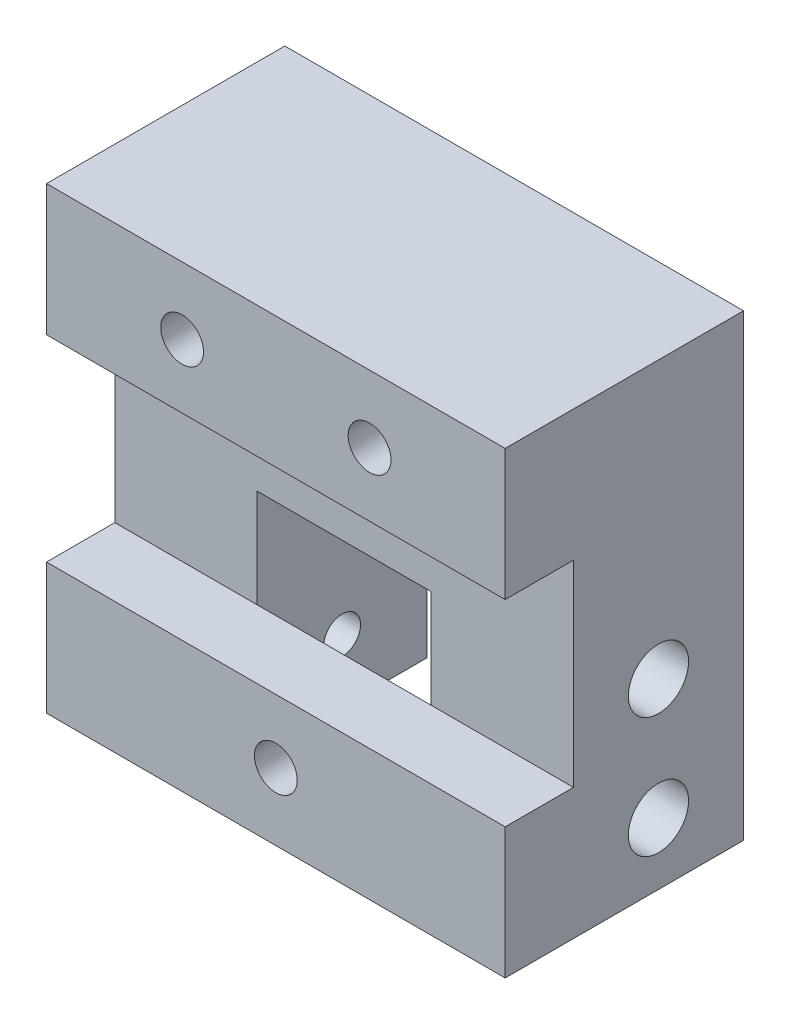
ISO-10303-21;
HEADER;
FILE_DESCRIPTION(('STEP AP214'),'2;1');
FILE_NAME('part.step','',(''),(''),'','','');
FILE_SCHEMA(('AUTOMOTIVE_DESIGN { 1 0 10303 214 1 1 1 1 }'));
ENDSEC;
DATA;
#1=APPLICATION_CONTEXT('core data for automotive mechanical design processes');
#2=APPLICATION_PROTOCOL_DEFINITION('international standard','automotive_design',2000,#1);
#3=PRODUCT_CONTEXT('',#1,'mechanical');
#4=PRODUCT('Part','Part','',(#3));
#5=PRODUCT_RELATED_PRODUCT_CATEGORY('part','',(#4));
#6=PRODUCT_DEFINITION_FORMATION('','',#4);
#7=PRODUCT_DEFINITION_CONTEXT('part definition',#1,'design');
#8=PRODUCT_DEFINITION('design','',#6,#7);
#9=PRODUCT_DEFINITION_SHAPE('','',#8);
#10=(LENGTH_UNIT() NAMED_UNIT(*) SI_UNIT(.MILLI.,.METRE.));
#11=(NAMED_UNIT(*) PLANE_ANGLE_UNIT() SI_UNIT($,.RADIAN.));
#12=(NAMED_UNIT(*) SI_UNIT($,.STERADIAN.) SOLID_ANGLE_UNIT());
#13=UNCERTAINTY_MEASURE_WITH_UNIT(LENGTH_MEASURE(1.E-05),#10,'distance_accuracy_value','');
#14=(GEOMETRIC_REPRESENTATION_CONTEXT(3) GLOBAL_UNCERTAINTY_ASSIGNED_CONTEXT((#13)) GLOBAL_UNIT_ASSIGNED_CONTEXT((#10,
#11,#12)) REPRESENTATION_CONTEXT('',''));
#15=CARTESIAN_POINT('',(0.,0.,0.));
#16=DIRECTION('',(0.,0.,1.));
#17=DIRECTION('',(1.,0.,0.));
#18=AXIS2_PLACEMENT_3D('',#15,#16,#17);
#19=CARTESIAN_POINT('',(-34.26,-25.,12.7));
#20=DIRECTION('',(1.,0.,0.));
#21=DIRECTION('',(0.,0.,-1.));
#22=AXIS2_PLACEMENT_3D('',#19,#20,#21);
#23=CYLINDRICAL_SURFACE('',#22,2.75);
#24=CARTESIAN_POINT('',(-13.,-25.,12.7));
#25=DIRECTION('',(-1.,0.,0.));
#26=DIRECTION('',(0.,-1.,0.));
#27=AXIS2_PLACEMENT_3D('',#24,#25,#26);
#28=CIRCLE('',#27,2.75);
#29=CARTESIAN_POINT('',(-13.,-27.75,12.7));
#30=VERTEX_POINT('',#29);
#31=EDGE_CURVE('E255',#30,#30,#28,.T.);
#32=ORIENTED_EDGE('',*,*,#31,.F.);
#33=EDGE_LOOP('',(#32));
#34=FACE_BOUND('',#33,.T.);
#35=CARTESIAN_POINT('',(-21.,-25.,12.7));
#36=DIRECTION('',(-1.,0.,0.));
#37=DIRECTION('',(0.,-1.,0.));
#38=AXIS2_PLACEMENT_3D('',#35,#36,#37);
#39=CIRCLE('',#38,2.75);
#40=CARTESIAN_POINT('',(-21.,-27.75,12.7));
#41=VERTEX_POINT('',#40);
#42=EDGE_CURVE('E43',#41,#41,#39,.F.);
#43=ORIENTED_EDGE('',*,*,#42,.F.);
#44=EDGE_LOOP('',(#43));
#45=FACE_BOUND('',#44,.T.);
#46=ADVANCED_FACE('F39',(#34,#45),#23,.F.);
#47=CARTESIAN_POINT('',(-34.26,-7.,12.7));
#48=DIRECTION('',(1.,0.,0.));
#49=DIRECTION('',(0.,0.,-1.));
#50=AXIS2_PLACEMENT_3D('',#47,#48,#49);
#51=CYLINDRICAL_SURFACE('',#50,2.75);
#52=CARTESIAN_POINT('',(-13.,-7.,12.7));
#53=DIRECTION('',(-1.,0.,0.));
#54=DIRECTION('',(0.,-1.,0.));
#55=AXIS2_PLACEMENT_3D('',#52,#53,#54);
#56=CIRCLE('',#55,2.75);
#57=CARTESIAN_POINT('',(-13.,-9.75,12.7));
#58=VERTEX_POINT('',#57);
#59=EDGE_CURVE('E260',#58,#58,#56,.T.);
#60=ORIENTED_EDGE('',*,*,#59,.F.);
#61=EDGE_LOOP('',(#60));
#62=FACE_BOUND('',#61,.T.);
#63=CARTESIAN_POINT('',(-21.,-7.,12.7));
#64=DIRECTION('',(-1.,0.,0.));
#65=DIRECTION('',(0.,-1.,0.));
#66=AXIS2_PLACEMENT_3D('',#63,#64,#65);
#67=CIRCLE('',#66,2.75);
#68=CARTESIAN_POINT('',(-21.,-9.75,12.7));
#69=VERTEX_POINT('',#68);
#70=EDGE_CURVE('E268',#69,#69,#67,.F.);
#71=ORIENTED_EDGE('',*,*,#70,.F.);
#72=EDGE_LOOP('',(#71));
#73=FACE_BOUND('',#72,.T.);
#74=ADVANCED_FACE('F311',(#62,#73),#51,.F.);
#75=CARTESIAN_POINT('',(13.,-25.,12.7));
#76=DIRECTION('',(1.,0.,0.));
#77=DIRECTION('',(0.,1.,0.));
#78=AXIS2_PLACEMENT_3D('',#75,#76,#77);
#79=CIRCLE('',#78,2.75);
#80=CARTESIAN_POINT('',(13.,-22.25,12.7));
#81=VERTEX_POINT('',#80);
#82=EDGE_CURVE('E258',#81,#81,#79,.T.);
#83=ORIENTED_EDGE('',*,*,#82,.F.);
#84=EDGE_LOOP('',(#83));
#85=FACE_BOUND('',#84,.T.);
#86=CARTESIAN_POINT('',(21.,-25.,12.7));
#87=DIRECTION('',(1.,0.,0.));
#88=DIRECTION('',(0.,1.,0.));
#89=AXIS2_PLACEMENT_3D('',#86,#87,#88);
#90=CIRCLE('',#89,2.75);
#91=CARTESIAN_POINT('',(21.,-22.25,12.7));
#92=VERTEX_POINT('',#91);
#93=EDGE_CURVE('E259',#92,#92,#90,.F.);
#94=ORIENTED_EDGE('',*,*,#93,.F.);
#95=EDGE_LOOP('',(#94));
#96=FACE_BOUND('',#95,.T.);
#97=ADVANCED_FACE('F309',(#85,#96),#23,.F.);
#98=CARTESIAN_POINT('',(13.,-7.,12.7));
#99=DIRECTION('',(1.,0.,0.));
#100=DIRECTION('',(0.,1.,0.));
#101=AXIS2_PLACEMENT_3D('',#98,#99,#100);
#102=CIRCLE('',#101,2.75);
#103=CARTESIAN_POINT('',(13.,-4.25,12.7));
#104=VERTEX_POINT('',#103);
#105=EDGE_CURVE('E169',#104,#104,#102,.T.);
#106=ORIENTED_EDGE('',*,*,#105,.F.);
#107=EDGE_LOOP('',(#106));
#108=FACE_BOUND('',#107,.T.);
#109=CARTESIAN_POINT('',(21.,-7.,12.7));
#110=DIRECTION('',(1.,0.,0.));
#111=DIRECTION('',(0.,1.,0.));
#112=AXIS2_PLACEMENT_3D('',#109,#110,#111);
#113=CIRCLE('',#112,2.75);
#114=CARTESIAN_POINT('',(21.,-4.25,12.7));
#115=VERTEX_POINT('',#114);
#116=EDGE_CURVE('E263',#115,#115,#113,.F.);
#117=ORIENTED_EDGE('',*,*,#116,.F.);
#118=EDGE_LOOP('',(#117));
#119=FACE_BOUND('',#118,.T.);
#120=ADVANCED_FACE('F305',(#108,#119),#51,.F.);
#121=CARTESIAN_POINT('',(0.,0.,35.6));
#122=DIRECTION('',(0.,0.,1.));
#123=DIRECTION('',(1.,0.,0.));
#124=AXIS2_PLACEMENT_3D('',#121,#122,#123);
#125=PLANE('',#124);
#126=CARTESIAN_POINT('',(-14.,24.2141445,35.6));
#127=DIRECTION('',(0.,0.,1.));
#128=DIRECTION('',(1.,0.,0.));
#129=AXIS2_PLACEMENT_3D('',#126,#127,#128);
#130=CIRCLE('',#129,3.2);
#131=CARTESIAN_POINT('',(-10.8,24.2141445,35.6));
#132=VERTEX_POINT('',#131);
#133=EDGE_CURVE('E183',#132,#132,#130,.T.);
#134=ORIENTED_EDGE('',*,*,#133,.F.);
#135=EDGE_LOOP('',(#134));
#136=FACE_BOUND('',#135,.T.);
#137=CARTESIAN_POINT('',(14.,24.2141445,35.6));
#138=DIRECTION('',(0.,0.,1.));
#139=DIRECTION('',(1.,0.,0.));
#140=AXIS2_PLACEMENT_3D('',#137,#138,#139);
#141=CIRCLE('',#140,3.2);
#142=CARTESIAN_POINT('',(17.2,24.2141445,35.6));
#143=VERTEX_POINT('',#142);
#144=EDGE_CURVE('E186',#143,#143,#141,.T.);
#145=ORIENTED_EDGE('',*,*,#144,.F.);
#146=EDGE_LOOP('',(#145));
#147=FACE_BOUND('',#146,.T.);
#148=DIRECTION('',(-1.,0.,0.));
#149=VECTOR('',#148,1.);
#150=CARTESIAN_POINT('',(-34.26,14.7,35.6));
#151=LINE('',#150,#149);
#152=CARTESIAN_POINT('',(34.26,14.7,35.6));
#153=VERTEX_POINT('',#152);
#154=CARTESIAN_POINT('',(-34.26,14.7,35.6));
#155=VERTEX_POINT('',#154);
#156=EDGE_CURVE('E201',#153,#155,#151,.T.);
#157=ORIENTED_EDGE('',*,*,#156,.F.);
#158=DIRECTION('',(0.,1.,0.));
#159=VECTOR('',#158,1.);
#160=CARTESIAN_POINT('',(34.26,34.26,35.6));
#161=LINE('',#160,#159);
#162=CARTESIAN_POINT('',(34.26,34.26,35.6));
#163=VERTEX_POINT('',#162);
#164=EDGE_CURVE('E229',#153,#163,#161,.T.);
#165=ORIENTED_EDGE('',*,*,#164,.T.);
#166=DIRECTION('',(-1.,0.,0.));
#167=VECTOR('',#166,1.);
#168=CARTESIAN_POINT('',(-34.26,34.26,35.6));
#169=LINE('',#168,#167);
#170=CARTESIAN_POINT('',(-34.26,34.26,35.6));
#171=VERTEX_POINT('',#170);
#172=EDGE_CURVE('E233',#163,#171,#169,.T.);
#173=ORIENTED_EDGE('',*,*,#172,.T.);
#174=DIRECTION('',(0.,-1.,0.));
#175=VECTOR('',#174,1.);
#176=CARTESIAN_POINT('',(-34.26,34.26,35.6));
#177=LINE('',#176,#175);
#178=EDGE_CURVE('E223',#171,#155,#177,.T.);
#179=ORIENTED_EDGE('',*,*,#178,.T.);
#180=EDGE_LOOP('',(#157,#165,#173,#179));
#181=FACE_BOUND('',#180,.T.);
#182=ADVANCED_FACE('F308',(#136,#147,#181),#125,.T.);
#183=CARTESIAN_POINT('',(-34.26,34.26,35.6));
#184=DIRECTION('',(1.,0.,0.));
#185=DIRECTION('',(0.,0.,-1.));
#186=AXIS2_PLACEMENT_3D('',#183,#184,#185);
#187=PLANE('',#186);
#188=CARTESIAN_POINT('',(-34.26,-7.,12.7));
#189=DIRECTION('',(-1.,0.,0.));
#190=DIRECTION('',(0.,-1.,0.));
#191=AXIS2_PLACEMENT_3D('',#188,#189,#190);
#192=CIRCLE('',#191,4.5);
#193=CARTESIAN_POINT('',(-34.26,-11.5,12.7));
#194=VERTEX_POINT('',#193);
#195=EDGE_CURVE('E276',#194,#194,#192,.T.);
#196=ORIENTED_EDGE('',*,*,#195,.F.);
#197=EDGE_LOOP('',(#196));
#198=FACE_BOUND('',#197,.T.);
#199=CARTESIAN_POINT('',(-34.26,-25.,12.7));
#200=DIRECTION('',(-1.,0.,0.));
#201=DIRECTION('',(0.,-1.,0.));
#202=AXIS2_PLACEMENT_3D('',#199,#200,#201);
#203=CIRCLE('',#202,4.5);
#204=CARTESIAN_POINT('',(-34.26,-29.5,12.7));
#205=VERTEX_POINT('',#204);
#206=EDGE_CURVE('E281',#205,#205,#203,.T.);
#207=ORIENTED_EDGE('',*,*,#206,.F.);
#208=EDGE_LOOP('',(#207));
#209=FACE_BOUND('',#208,.T.);
#210=DIRECTION('',(0.,-1.,0.));
#211=VECTOR('',#210,1.);
#212=CARTESIAN_POINT('',(-34.26,-14.7,25.4));
#213=LINE('',#212,#211);
#214=CARTESIAN_POINT('',(-34.26,14.7,25.4));
#215=VERTEX_POINT('',#214);
#216=CARTESIAN_POINT('',(-34.26,-14.7,25.4));
#217=VERTEX_POINT('',#216);
#218=EDGE_CURVE('E197',#215,#217,#213,.T.);
#219=ORIENTED_EDGE('',*,*,#218,.F.);
#220=DIRECTION('',(0.,0.,1.));
#221=VECTOR('',#220,1.);
#222=CARTESIAN_POINT('',(-34.26,14.7,25.4));
#223=LINE('',#222,#221);
#224=EDGE_CURVE('E213',#215,#155,#223,.T.);
#225=ORIENTED_EDGE('',*,*,#224,.T.);
#226=ORIENTED_EDGE('',*,*,#178,.F.);
#227=DIRECTION('',(0.,0.,-1.));
#228=VECTOR('',#227,1.);
#229=CARTESIAN_POINT('',(-34.26,34.26,35.6));
#230=LINE('',#229,#228);
#231=CARTESIAN_POINT('',(-34.26,34.26,0.));
#232=VERTEX_POINT('',#231);
#233=EDGE_CURVE('E235',#171,#232,#230,.T.);
#234=ORIENTED_EDGE('',*,*,#233,.T.);
#235=DIRECTION('',(0.,-1.,0.));
#236=VECTOR('',#235,1.);
#237=CARTESIAN_POINT('',(-34.26,34.26,0.));
#238=LINE('',#237,#236);
#239=CARTESIAN_POINT('',(-34.26,-34.26,0.));
#240=VERTEX_POINT('',#239);
#241=EDGE_CURVE('E216',#232,#240,#238,.T.);
#242=ORIENTED_EDGE('',*,*,#241,.T.);
#243=DIRECTION('',(0.,0.,-1.));
#244=VECTOR('',#243,1.);
#245=CARTESIAN_POINT('',(-34.26,-34.26,35.6));
#246=LINE('',#245,#244);
#247=CARTESIAN_POINT('',(-34.26,-34.26,35.6));
#248=VERTEX_POINT('',#247);
#249=EDGE_CURVE('E48',#248,#240,#246,.T.);
#250=ORIENTED_EDGE('',*,*,#249,.F.);
#251=CARTESIAN_POINT('',(-34.26,-14.7,35.6));
#252=VERTEX_POINT('',#251);
#253=EDGE_CURVE('E227',#252,#248,#177,.T.);
#254=ORIENTED_EDGE('',*,*,#253,.F.);
#255=DIRECTION('',(0.,0.,1.));
#256=VECTOR('',#255,1.);
#257=CARTESIAN_POINT('',(-34.26,-14.7,25.4));
#258=LINE('',#257,#256);
#259=EDGE_CURVE('E210',#217,#252,#258,.T.);
#260=ORIENTED_EDGE('',*,*,#259,.F.);
#261=EDGE_LOOP('',(#219,#225,#226,#234,#242,#250,#254,#260));
#262=FACE_BOUND('',#261,.T.);
#263=ADVANCED_FACE('F41',(#198,#209,#262),#187,.F.);
#264=CARTESIAN_POINT('',(-34.26,-34.26,35.6));
#265=DIRECTION('',(0.,1.,0.));
#266=DIRECTION('',(-1.,0.,0.));
#267=AXIS2_PLACEMENT_3D('',#264,#265,#266);
#268=PLANE('',#267);
#269=DIRECTION('',(-1.,0.,0.));
#270=VECTOR('',#269,1.);
#271=CARTESIAN_POINT('',(13.,-34.26,25.4));
#272=LINE('',#271,#270);
#273=CARTESIAN_POINT('',(13.,-34.26,25.4));
#274=VERTEX_POINT('',#273);
#275=CARTESIAN_POINT('',(-13.,-34.26,25.4));
#276=VERTEX_POINT('',#275);
#277=EDGE_CURVE('E142',#274,#276,#272,.T.);
#278=ORIENTED_EDGE('',*,*,#277,.F.);
#279=DIRECTION('',(0.,0.,-1.));
#280=VECTOR('',#279,1.);
#281=CARTESIAN_POINT('',(13.,-34.26,25.4));
#282=LINE('',#281,#280);
#283=CARTESIAN_POINT('',(13.,-34.26,0.));
#284=VERTEX_POINT('',#283);
#285=EDGE_CURVE('E152',#274,#284,#282,.T.);
#286=ORIENTED_EDGE('',*,*,#285,.T.);
#287=DIRECTION('',(1.,0.,0.));
#288=VECTOR('',#287,1.);
#289=CARTESIAN_POINT('',(-34.26,-34.26,0.));
#290=LINE('',#289,#288);
#291=CARTESIAN_POINT('',(34.26,-34.26,0.));
#292=VERTEX_POINT('',#291);
#293=EDGE_CURVE('E238',#284,#292,#290,.T.);
#294=ORIENTED_EDGE('',*,*,#293,.T.);
#295=DIRECTION('',(0.,0.,-1.));
#296=VECTOR('',#295,1.);
#297=CARTESIAN_POINT('',(34.26,-34.26,35.6));
#298=LINE('',#297,#296);
#299=CARTESIAN_POINT('',(34.26,-34.26,35.6));
#300=VERTEX_POINT('',#299);
#301=EDGE_CURVE('E250',#300,#292,#298,.T.);
#302=ORIENTED_EDGE('',*,*,#301,.F.);
#303=DIRECTION('',(1.,0.,0.));
#304=VECTOR('',#303,1.);
#305=CARTESIAN_POINT('',(-34.26,-34.26,35.6));
#306=LINE('',#305,#304);
#307=EDGE_CURVE('E226',#248,#300,#306,.T.);
#308=ORIENTED_EDGE('',*,*,#307,.F.);
#309=ORIENTED_EDGE('',*,*,#249,.T.);
#310=CARTESIAN_POINT('',(-13.,-34.26,0.));
#311=VERTEX_POINT('',#310);
#312=EDGE_CURVE('E239',#240,#311,#290,.T.);
#313=ORIENTED_EDGE('',*,*,#312,.T.);
#314=DIRECTION('',(0.,0.,-1.));
#315=VECTOR('',#314,1.);
#316=CARTESIAN_POINT('',(-13.,-34.26,25.4));
#317=LINE('',#316,#315);
#318=EDGE_CURVE('E56',#276,#311,#317,.T.);
#319=ORIENTED_EDGE('',*,*,#318,.F.);
#320=EDGE_LOOP('',(#278,#286,#294,#302,#308,#309,#313,#319));
#321=FACE_BOUND('',#320,.T.);
#322=ADVANCED_FACE('F159',(#321),#268,.F.);
#323=CARTESIAN_POINT('',(34.26,34.26,35.6));
#324=DIRECTION('',(-1.,0.,0.));
#325=DIRECTION('',(0.,0.,1.));
#326=AXIS2_PLACEMENT_3D('',#323,#324,#325);
#327=PLANE('',#326);
#328=CARTESIAN_POINT('',(34.26,-7.,12.7));
#329=DIRECTION('',(1.,0.,0.));
#330=DIRECTION('',(0.,0.,-1.));
#331=AXIS2_PLACEMENT_3D('',#328,#329,#330);
#332=CIRCLE('',#331,4.5);
#333=CARTESIAN_POINT('',(34.26,-7.,8.2));
#334=VERTEX_POINT('',#333);
#335=EDGE_CURVE('E289',#334,#334,#332,.T.);
#336=ORIENTED_EDGE('',*,*,#335,.F.);
#337=EDGE_LOOP('',(#336));
#338=FACE_BOUND('',#337,.T.);
#339=CARTESIAN_POINT('',(34.26,-25.,12.7));
#340=DIRECTION('',(1.,0.,0.));
#341=DIRECTION('',(0.,0.,-1.));
#342=AXIS2_PLACEMENT_3D('',#339,#340,#341);
#343=CIRCLE('',#342,4.5);
#344=CARTESIAN_POINT('',(34.26,-25.,8.2));
#345=VERTEX_POINT('',#344);
#346=EDGE_CURVE('E292',#345,#345,#343,.T.);
#347=ORIENTED_EDGE('',*,*,#346,.F.);
#348=EDGE_LOOP('',(#347));
#349=FACE_BOUND('',#348,.T.);
#350=ORIENTED_EDGE('',*,*,#164,.F.);
#351=DIRECTION('',(0.,0.,1.));
#352=VECTOR('',#351,1.);
#353=CARTESIAN_POINT('',(34.26,14.7,25.4));
#354=LINE('',#353,#352);
#355=CARTESIAN_POINT('',(34.26,14.7,25.4));
#356=VERTEX_POINT('',#355);
#357=EDGE_CURVE('E217',#356,#153,#354,.T.);
#358=ORIENTED_EDGE('',*,*,#357,.F.);
#359=DIRECTION('',(0.,1.,0.));
#360=VECTOR('',#359,1.);
#361=CARTESIAN_POINT('',(34.26,-14.7,25.4));
#362=LINE('',#361,#360);
#363=CARTESIAN_POINT('',(34.26,-14.7,25.4));
#364=VERTEX_POINT('',#363);
#365=EDGE_CURVE('E205',#364,#356,#362,.T.);
#366=ORIENTED_EDGE('',*,*,#365,.F.);
#367=DIRECTION('',(0.,0.,1.));
#368=VECTOR('',#367,1.);
#369=CARTESIAN_POINT('',(34.26,-14.7,25.4));
#370=LINE('',#369,#368);
#371=CARTESIAN_POINT('',(34.26,-14.7,35.6));
#372=VERTEX_POINT('',#371);
#373=EDGE_CURVE('E219',#364,#372,#370,.T.);
#374=ORIENTED_EDGE('',*,*,#373,.T.);
#375=EDGE_CURVE('E230',#300,#372,#161,.T.);
#376=ORIENTED_EDGE('',*,*,#375,.F.);
#377=ORIENTED_EDGE('',*,*,#301,.T.);
#378=DIRECTION('',(0.,1.,0.));
#379=VECTOR('',#378,1.);
#380=CARTESIAN_POINT('',(34.26,34.26,0.));
#381=LINE('',#380,#379);
#382=CARTESIAN_POINT('',(34.26,34.26,0.));
#383=VERTEX_POINT('',#382);
#384=EDGE_CURVE('E241',#292,#383,#381,.T.);
#385=ORIENTED_EDGE('',*,*,#384,.T.);
#386=DIRECTION('',(0.,0.,-1.));
#387=VECTOR('',#386,1.);
#388=CARTESIAN_POINT('',(34.26,34.26,35.6));
#389=LINE('',#388,#387);
#390=EDGE_CURVE('E247',#163,#383,#389,.T.);
#391=ORIENTED_EDGE('',*,*,#390,.F.);
#392=EDGE_LOOP('',(#350,#358,#366,#374,#376,#377,#385,#391));
#393=FACE_BOUND('',#392,.T.);
#394=ADVANCED_FACE('F364',(#338,#349,#393),#327,.F.);
#395=CARTESIAN_POINT('',(-34.26,34.26,35.6));
#396=DIRECTION('',(0.,-1.,0.));
#397=DIRECTION('',(1.,0.,0.));
#398=AXIS2_PLACEMENT_3D('',#395,#396,#397);
#399=PLANE('',#398);
#400=DIRECTION('',(-1.,0.,0.));
#401=VECTOR('',#400,1.);
#402=CARTESIAN_POINT('',(-34.26,34.26,0.));
#403=LINE('',#402,#401);
#404=EDGE_CURVE('E243',#383,#232,#403,.T.);
#405=ORIENTED_EDGE('',*,*,#404,.T.);
#406=ORIENTED_EDGE('',*,*,#233,.F.);
#407=ORIENTED_EDGE('',*,*,#172,.F.);
#408=ORIENTED_EDGE('',*,*,#390,.T.);
#409=EDGE_LOOP('',(#405,#406,#407,#408));
#410=FACE_BOUND('',#409,.T.);
#411=ADVANCED_FACE('F367',(#410),#399,.F.);
#412=CARTESIAN_POINT('',(0.,-24.2141445,35.6));
#413=DIRECTION('',(0.,0.,1.));
#414=DIRECTION('',(1.,0.,0.));
#415=AXIS2_PLACEMENT_3D('',#412,#413,#414);
#416=CIRCLE('',#415,3.2);
#417=CARTESIAN_POINT('',(3.2,-24.2141445,35.6));
#418=VERTEX_POINT('',#417);
#419=EDGE_CURVE('E192',#418,#418,#416,.T.);
#420=ORIENTED_EDGE('',*,*,#419,.F.);
#421=EDGE_LOOP('',(#420));
#422=FACE_BOUND('',#421,.T.);
#423=DIRECTION('',(1.,0.,0.));
#424=VECTOR('',#423,1.);
#425=CARTESIAN_POINT('',(-34.26,-14.7,35.6));
#426=LINE('',#425,#424);
#427=EDGE_CURVE('E182',#252,#372,#426,.T.);
#428=ORIENTED_EDGE('',*,*,#427,.F.);
#429=ORIENTED_EDGE('',*,*,#253,.T.);
#430=ORIENTED_EDGE('',*,*,#307,.T.);
#431=ORIENTED_EDGE('',*,*,#375,.T.);
#432=EDGE_LOOP('',(#428,#429,#430,#431));
#433=FACE_BOUND('',#432,.T.);
#434=ADVANCED_FACE('F394',(#422,#433),#125,.T.);
#435=CARTESIAN_POINT('',(0.,0.,0.));
#436=DIRECTION('',(0.,0.,1.));
#437=DIRECTION('',(1.,0.,0.));
#438=AXIS2_PLACEMENT_3D('',#435,#436,#437);
#439=PLANE('',#438);
#440=ORIENTED_EDGE('',*,*,#293,.F.);
#441=DIRECTION('',(0.,-1.,0.));
#442=VECTOR('',#441,1.);
#443=CARTESIAN_POINT('',(13.,-34.26,0.));
#444=LINE('',#443,#442);
#445=CARTESIAN_POINT('',(13.,0.,0.));
#446=VERTEX_POINT('',#445);
#447=EDGE_CURVE('E155',#446,#284,#444,.T.);
#448=ORIENTED_EDGE('',*,*,#447,.F.);
#449=DIRECTION('',(1.,0.,0.));
#450=VECTOR('',#449,1.);
#451=CARTESIAN_POINT('',(13.,0.,0.));
#452=LINE('',#451,#450);
#453=CARTESIAN_POINT('',(-13.,0.,0.));
#454=VERTEX_POINT('',#453);
#455=EDGE_CURVE('E149',#454,#446,#452,.T.);
#456=ORIENTED_EDGE('',*,*,#455,.F.);
#457=DIRECTION('',(0.,1.,0.));
#458=VECTOR('',#457,1.);
#459=CARTESIAN_POINT('',(-13.,-34.26,0.));
#460=LINE('',#459,#458);
#461=EDGE_CURVE('E168',#311,#454,#460,.T.);
#462=ORIENTED_EDGE('',*,*,#461,.F.);
#463=ORIENTED_EDGE('',*,*,#312,.F.);
#464=ORIENTED_EDGE('',*,*,#241,.F.);
#465=ORIENTED_EDGE('',*,*,#404,.F.);
#466=ORIENTED_EDGE('',*,*,#384,.F.);
#467=EDGE_LOOP('',(#440,#448,#456,#462,#463,#464,#465,#466));
#468=FACE_BOUND('',#467,.T.);
#469=ADVANCED_FACE('F401',(#468),#439,.F.);
#470=CARTESIAN_POINT('',(-34.26,14.7,25.4));
#471=DIRECTION('',(0.,1.,0.));
#472=DIRECTION('',(-1.,0.,0.));
#473=AXIS2_PLACEMENT_3D('',#470,#471,#472);
#474=PLANE('',#473);
#475=ORIENTED_EDGE('',*,*,#156,.T.);
#476=ORIENTED_EDGE('',*,*,#224,.F.);
#477=DIRECTION('',(-1.,0.,0.));
#478=VECTOR('',#477,1.);
#479=CARTESIAN_POINT('',(-34.26,14.7,25.4));
#480=LINE('',#479,#478);
#481=EDGE_CURVE('E207',#356,#215,#480,.T.);
#482=ORIENTED_EDGE('',*,*,#481,.F.);
#483=ORIENTED_EDGE('',*,*,#357,.T.);
#484=EDGE_LOOP('',(#475,#476,#482,#483));
#485=FACE_BOUND('',#484,.T.);
#486=ADVANCED_FACE('F380',(#485),#474,.F.);
#487=CARTESIAN_POINT('',(-34.26,-14.7,25.4));
#488=DIRECTION('',(0.,-1.,0.));
#489=DIRECTION('',(1.,0.,0.));
#490=AXIS2_PLACEMENT_3D('',#487,#488,#489);
#491=PLANE('',#490);
#492=ORIENTED_EDGE('',*,*,#427,.T.);
#493=ORIENTED_EDGE('',*,*,#373,.F.);
#494=DIRECTION('',(1.,0.,0.));
#495=VECTOR('',#494,1.);
#496=CARTESIAN_POINT('',(-34.26,-14.7,25.4));
#497=LINE('',#496,#495);
#498=CARTESIAN_POINT('',(13.,-14.7,25.4));
#499=VERTEX_POINT('',#498);
#500=EDGE_CURVE('E200',#499,#364,#497,.T.);
#501=ORIENTED_EDGE('',*,*,#500,.F.);
#502=CARTESIAN_POINT('',(-13.,-14.7,25.4));
#503=VERTEX_POINT('',#502);
#504=EDGE_CURVE('E144',#503,#499,#497,.T.);
#505=ORIENTED_EDGE('',*,*,#504,.F.);
#506=EDGE_CURVE('E202',#217,#503,#497,.T.);
#507=ORIENTED_EDGE('',*,*,#506,.F.);
#508=ORIENTED_EDGE('',*,*,#259,.T.);
#509=EDGE_LOOP('',(#492,#493,#501,#505,#507,#508));
#510=FACE_BOUND('',#509,.T.);
#511=ADVANCED_FACE('F405',(#510),#491,.F.);
#512=CARTESIAN_POINT('',(0.,0.,25.4));
#513=DIRECTION('',(0.,0.,-1.));
#514=DIRECTION('',(-1.,0.,0.));
#515=AXIS2_PLACEMENT_3D('',#512,#513,#514);
#516=PLANE('',#515);
#517=DIRECTION('',(1.,0.,0.));
#518=VECTOR('',#517,1.);
#519=CARTESIAN_POINT('',(13.,0.,25.4));
#520=LINE('',#519,#518);
#521=CARTESIAN_POINT('',(-13.,0.,25.4));
#522=VERTEX_POINT('',#521);
#523=CARTESIAN_POINT('',(13.,0.,25.4));
#524=VERTEX_POINT('',#523);
#525=EDGE_CURVE('E64',#522,#524,#520,.T.);
#526=ORIENTED_EDGE('',*,*,#525,.T.);
#527=DIRECTION('',(0.,-1.,0.));
#528=VECTOR('',#527,1.);
#529=CARTESIAN_POINT('',(13.,-34.26,25.4));
#530=LINE('',#529,#528);
#531=EDGE_CURVE('E148',#524,#499,#530,.T.);
#532=ORIENTED_EDGE('',*,*,#531,.T.);
#533=ORIENTED_EDGE('',*,*,#500,.T.);
#534=ORIENTED_EDGE('',*,*,#365,.T.);
#535=ORIENTED_EDGE('',*,*,#481,.T.);
#536=ORIENTED_EDGE('',*,*,#218,.T.);
#537=ORIENTED_EDGE('',*,*,#506,.T.);
#538=DIRECTION('',(0.,1.,0.));
#539=VECTOR('',#538,1.);
#540=CARTESIAN_POINT('',(-13.,0.,25.4));
#541=LINE('',#540,#539);
#542=EDGE_CURVE('E12',#503,#522,#541,.T.);
#543=ORIENTED_EDGE('',*,*,#542,.T.);
#544=EDGE_LOOP('',(#526,#532,#533,#534,#535,#536,#537,#543));
#545=FACE_BOUND('',#544,.T.);
#546=ADVANCED_FACE('F387',(#545),#516,.F.);
#547=CARTESIAN_POINT('',(0.,-24.2141445,25.4));
#548=DIRECTION('',(0.,0.,1.));
#549=DIRECTION('',(1.,0.,0.));
#550=AXIS2_PLACEMENT_3D('',#547,#548,#549);
#551=CYLINDRICAL_SURFACE('',#550,3.2);
#552=CARTESIAN_POINT('',(0.,-24.2141445,25.4));
#553=DIRECTION('',(0.,0.,1.));
#554=DIRECTION('',(1.,0.,0.));
#555=AXIS2_PLACEMENT_3D('',#552,#553,#554);
#556=CIRCLE('',#555,3.2);
#557=CARTESIAN_POINT('',(3.2,-24.2141445,25.4));
#558=VERTEX_POINT('',#557);
#559=EDGE_CURVE('E175',#558,#558,#556,.T.);
#560=ORIENTED_EDGE('',*,*,#559,.F.);
#561=EDGE_LOOP('',(#560));
#562=FACE_BOUND('',#561,.T.);
#563=ORIENTED_EDGE('',*,*,#419,.T.);
#564=EDGE_LOOP('',(#563));
#565=FACE_BOUND('',#564,.T.);
#566=ADVANCED_FACE('F412',(#562,#565),#551,.F.);
#567=CARTESIAN_POINT('',(14.,24.2141445,25.4));
#568=DIRECTION('',(0.,0.,1.));
#569=DIRECTION('',(1.,0.,0.));
#570=AXIS2_PLACEMENT_3D('',#567,#568,#569);
#571=CYLINDRICAL_SURFACE('',#570,3.2);
#572=CARTESIAN_POINT('',(14.,24.2141445,25.4));
#573=DIRECTION('',(0.,0.,1.));
#574=DIRECTION('',(1.,0.,0.));
#575=AXIS2_PLACEMENT_3D('',#572,#573,#574);
#576=CIRCLE('',#575,3.2);
#577=CARTESIAN_POINT('',(17.2,24.2141445,25.4));
#578=VERTEX_POINT('',#577);
#579=EDGE_CURVE('E189',#578,#578,#576,.T.);
#580=ORIENTED_EDGE('',*,*,#579,.F.);
#581=EDGE_LOOP('',(#580));
#582=FACE_BOUND('',#581,.T.);
#583=ORIENTED_EDGE('',*,*,#144,.T.);
#584=EDGE_LOOP('',(#583));
#585=FACE_BOUND('',#584,.T.);
#586=ADVANCED_FACE('F586',(#582,#585),#571,.F.);
#587=CARTESIAN_POINT('',(14.,24.2141445,25.4));
#588=DIRECTION('',(0.,0.,1.));
#589=DIRECTION('',(1.,0.,0.));
#590=AXIS2_PLACEMENT_3D('',#587,#588,#589);
#591=PLANE('',#590);
#592=ORIENTED_EDGE('',*,*,#579,.T.);
#593=EDGE_LOOP('',(#592));
#594=FACE_BOUND('',#593,.T.);
#595=ADVANCED_FACE('F576',(#594),#591,.T.);
#596=CARTESIAN_POINT('',(-14.,24.2141445,25.4));
#597=DIRECTION('',(0.,0.,1.));
#598=DIRECTION('',(1.,0.,0.));
#599=AXIS2_PLACEMENT_3D('',#596,#597,#598);
#600=CYLINDRICAL_SURFACE('',#599,3.2);
#601=CARTESIAN_POINT('',(-14.,24.2141445,25.4));
#602=DIRECTION('',(0.,0.,1.));
#603=DIRECTION('',(1.,0.,0.));
#604=AXIS2_PLACEMENT_3D('',#601,#602,#603);
#605=CIRCLE('',#604,3.2);
#606=CARTESIAN_POINT('',(-10.8,24.2141445,25.4));
#607=VERTEX_POINT('',#606);
#608=EDGE_CURVE('E179',#607,#607,#605,.T.);
#609=ORIENTED_EDGE('',*,*,#608,.F.);
#610=EDGE_LOOP('',(#609));
#611=FACE_BOUND('',#610,.T.);
#612=ORIENTED_EDGE('',*,*,#133,.T.);
#613=EDGE_LOOP('',(#612));
#614=FACE_BOUND('',#613,.T.);
#615=ADVANCED_FACE('F566',(#611,#614),#600,.F.);
#616=CARTESIAN_POINT('',(-14.,24.2141445,25.4));
#617=DIRECTION('',(0.,0.,1.));
#618=DIRECTION('',(1.,0.,0.));
#619=AXIS2_PLACEMENT_3D('',#616,#617,#618);
#620=PLANE('',#619);
#621=ORIENTED_EDGE('',*,*,#608,.T.);
#622=EDGE_LOOP('',(#621));
#623=FACE_BOUND('',#622,.T.);
#624=ADVANCED_FACE('F557',(#623),#620,.T.);
#625=CARTESIAN_POINT('',(0.,0.,25.4));
#626=DIRECTION('',(0.,0.,1.));
#627=DIRECTION('',(1.,0.,0.));
#628=AXIS2_PLACEMENT_3D('',#625,#626,#627);
#629=PLANE('',#628);
#630=ORIENTED_EDGE('',*,*,#559,.T.);
#631=EDGE_LOOP('',(#630));
#632=FACE_BOUND('',#631,.T.);
#633=EDGE_CURVE('E137',#499,#274,#530,.T.);
#634=ORIENTED_EDGE('',*,*,#633,.T.);
#635=ORIENTED_EDGE('',*,*,#277,.T.);
#636=DIRECTION('',(0.,1.,0.));
#637=VECTOR('',#636,1.);
#638=CARTESIAN_POINT('',(-13.,-34.26,25.4));
#639=LINE('',#638,#637);
#640=EDGE_CURVE('E161',#276,#503,#639,.T.);
#641=ORIENTED_EDGE('',*,*,#640,.T.);
#642=ORIENTED_EDGE('',*,*,#504,.T.);
#643=EDGE_LOOP('',(#634,#635,#641,#642));
#644=FACE_BOUND('',#643,.T.);
#645=ADVANCED_FACE('F139',(#632,#644),#629,.F.);
#646=CARTESIAN_POINT('',(13.,-34.26,25.4));
#647=DIRECTION('',(1.,0.,0.));
#648=DIRECTION('',(0.,1.,0.));
#649=AXIS2_PLACEMENT_3D('',#646,#647,#648);
#650=PLANE('',#649);
#651=ORIENTED_EDGE('',*,*,#105,.T.);
#652=EDGE_LOOP('',(#651));
#653=FACE_BOUND('',#652,.T.);
#654=ORIENTED_EDGE('',*,*,#82,.T.);
#655=EDGE_LOOP('',(#654));
#656=FACE_BOUND('',#655,.T.);
#657=ORIENTED_EDGE('',*,*,#447,.T.);
#658=ORIENTED_EDGE('',*,*,#285,.F.);
#659=ORIENTED_EDGE('',*,*,#633,.F.);
#660=ORIENTED_EDGE('',*,*,#531,.F.);
#661=DIRECTION('',(0.,0.,-1.));
#662=VECTOR('',#661,1.);
#663=CARTESIAN_POINT('',(13.,0.,25.4));
#664=LINE('',#663,#662);
#665=EDGE_CURVE('E173',#524,#446,#664,.T.);
#666=ORIENTED_EDGE('',*,*,#665,.T.);
#667=EDGE_LOOP('',(#657,#658,#659,#660,#666));
#668=FACE_BOUND('',#667,.T.);
#669=ADVANCED_FACE('F153',(#653,#656,#668),#650,.F.);
#670=CARTESIAN_POINT('',(13.,0.,25.4));
#671=DIRECTION('',(0.,1.,0.));
#672=DIRECTION('',(0.,0.,1.));
#673=AXIS2_PLACEMENT_3D('',#670,#671,#672);
#674=PLANE('',#673);
#675=ORIENTED_EDGE('',*,*,#455,.T.);
#676=ORIENTED_EDGE('',*,*,#665,.F.);
#677=ORIENTED_EDGE('',*,*,#525,.F.);
#678=DIRECTION('',(0.,0.,-1.));
#679=VECTOR('',#678,1.);
#680=CARTESIAN_POINT('',(-13.,0.,25.4));
#681=LINE('',#680,#679);
#682=EDGE_CURVE('E176',#522,#454,#681,.T.);
#683=ORIENTED_EDGE('',*,*,#682,.T.);
#684=EDGE_LOOP('',(#675,#676,#677,#683));
#685=FACE_BOUND('',#684,.T.);
#686=ADVANCED_FACE('F327',(#685),#674,.F.);
#687=CARTESIAN_POINT('',(-13.,-34.26,25.4));
#688=DIRECTION('',(-1.,0.,0.));
#689=DIRECTION('',(0.,-1.,0.));
#690=AXIS2_PLACEMENT_3D('',#687,#688,#689);
#691=PLANE('',#690);
#692=ORIENTED_EDGE('',*,*,#59,.T.);
#693=EDGE_LOOP('',(#692));
#694=FACE_BOUND('',#693,.T.);
#695=ORIENTED_EDGE('',*,*,#31,.T.);
#696=EDGE_LOOP('',(#695));
#697=FACE_BOUND('',#696,.T.);
#698=ORIENTED_EDGE('',*,*,#461,.T.);
#699=ORIENTED_EDGE('',*,*,#682,.F.);
#700=ORIENTED_EDGE('',*,*,#542,.F.);
#701=ORIENTED_EDGE('',*,*,#640,.F.);
#702=ORIENTED_EDGE('',*,*,#318,.T.);
#703=EDGE_LOOP('',(#698,#699,#700,#701,#702));
#704=FACE_BOUND('',#703,.T.);
#705=ADVANCED_FACE('F317',(#694,#697,#704),#691,.F.);
#706=CARTESIAN_POINT('',(21.,-34.26,25.4));
#707=DIRECTION('',(1.,0.,0.));
#708=DIRECTION('',(0.,1.,0.));
#709=AXIS2_PLACEMENT_3D('',#706,#707,#708);
#710=PLANE('',#709);
#711=CARTESIAN_POINT('',(21.,-7.,12.7));
#712=DIRECTION('',(1.,0.,0.));
#713=DIRECTION('',(0.,1.,0.));
#714=AXIS2_PLACEMENT_3D('',#711,#712,#713);
#715=CIRCLE('',#714,4.5);
#716=CARTESIAN_POINT('',(21.,-2.5,12.7));
#717=VERTEX_POINT('',#716);
#718=EDGE_CURVE('E266',#717,#717,#715,.F.);
#719=ORIENTED_EDGE('',*,*,#718,.F.);
#720=EDGE_LOOP('',(#719));
#721=FACE_BOUND('',#720,.T.);
#722=ORIENTED_EDGE('',*,*,#116,.T.);
#723=EDGE_LOOP('',(#722));
#724=FACE_BOUND('',#723,.T.);
#725=ADVANCED_FACE('F314',(#721,#724),#710,.T.);
#726=CARTESIAN_POINT('',(0.272077938642139,-7.,12.7));
#727=DIRECTION('',(1.,0.,0.));
#728=DIRECTION('',(0.,0.,-1.));
#729=AXIS2_PLACEMENT_3D('',#726,#727,#728);
#730=CYLINDRICAL_SURFACE('',#729,4.5);
#731=ORIENTED_EDGE('',*,*,#718,.T.);
#732=EDGE_LOOP('',(#731));
#733=FACE_BOUND('',#732,.T.);
#734=ORIENTED_EDGE('',*,*,#335,.T.);
#735=EDGE_LOOP('',(#734));
#736=FACE_BOUND('',#735,.T.);
#737=ADVANCED_FACE('F316',(#733,#736),#730,.F.);
#738=CARTESIAN_POINT('',(21.,-34.26,25.4));
#739=DIRECTION('',(1.,0.,0.));
#740=DIRECTION('',(0.,1.,0.));
#741=AXIS2_PLACEMENT_3D('',#738,#739,#740);
#742=PLANE('',#741);
#743=CARTESIAN_POINT('',(21.,-25.,12.7));
#744=DIRECTION('',(1.,0.,0.));
#745=DIRECTION('',(0.,1.,0.));
#746=AXIS2_PLACEMENT_3D('',#743,#744,#745);
#747=CIRCLE('',#746,4.5);
#748=CARTESIAN_POINT('',(21.,-20.5,12.7));
#749=VERTEX_POINT('',#748);
#750=EDGE_CURVE('E274',#749,#749,#747,.F.);
#751=ORIENTED_EDGE('',*,*,#750,.F.);
#752=EDGE_LOOP('',(#751));
#753=FACE_BOUND('',#752,.T.);
#754=ORIENTED_EDGE('',*,*,#93,.T.);
#755=EDGE_LOOP('',(#754));
#756=FACE_BOUND('',#755,.T.);
#757=ADVANCED_FACE('F324',(#753,#756),#742,.T.);
#758=CARTESIAN_POINT('',(0.272077938642139,-25.,12.7));
#759=DIRECTION('',(1.,0.,0.));
#760=DIRECTION('',(0.,0.,-1.));
#761=AXIS2_PLACEMENT_3D('',#758,#759,#760);
#762=CYLINDRICAL_SURFACE('',#761,4.5);
#763=ORIENTED_EDGE('',*,*,#750,.T.);
#764=EDGE_LOOP('',(#763));
#765=FACE_BOUND('',#764,.T.);
#766=ORIENTED_EDGE('',*,*,#346,.T.);
#767=EDGE_LOOP('',(#766));
#768=FACE_BOUND('',#767,.T.);
#769=ADVANCED_FACE('F351',(#765,#768),#762,.F.);
#770=CARTESIAN_POINT('',(-21.,-34.26,25.4));
#771=DIRECTION('',(-1.,0.,0.));
#772=DIRECTION('',(0.,-1.,0.));
#773=AXIS2_PLACEMENT_3D('',#770,#771,#772);
#774=PLANE('',#773);
#775=CARTESIAN_POINT('',(-21.,-7.,12.7));
#776=DIRECTION('',(-1.,0.,0.));
#777=DIRECTION('',(0.,-1.,0.));
#778=AXIS2_PLACEMENT_3D('',#775,#776,#777);
#779=CIRCLE('',#778,4.5);
#780=CARTESIAN_POINT('',(-21.,-11.5,12.7));
#781=VERTEX_POINT('',#780);
#782=EDGE_CURVE('E270',#781,#781,#779,.F.);
#783=ORIENTED_EDGE('',*,*,#782,.F.);
#784=EDGE_LOOP('',(#783));
#785=FACE_BOUND('',#784,.T.);
#786=ORIENTED_EDGE('',*,*,#70,.T.);
#787=EDGE_LOOP('',(#786));
#788=FACE_BOUND('',#787,.T.);
#789=ADVANCED_FACE('F357',(#785,#788),#774,.T.);
#790=CARTESIAN_POINT('',(-0.272077938642139,-7.,12.7));
#791=DIRECTION('',(-1.,0.,0.));
#792=DIRECTION('',(0.,-1.,0.));
#793=AXIS2_PLACEMENT_3D('',#790,#791,#792);
#794=CYLINDRICAL_SURFACE('',#793,4.5);
#795=ORIENTED_EDGE('',*,*,#782,.T.);
#796=EDGE_LOOP('',(#795));
#797=FACE_BOUND('',#796,.T.);
#798=ORIENTED_EDGE('',*,*,#195,.T.);
#799=EDGE_LOOP('',(#798));
#800=FACE_BOUND('',#799,.T.);
#801=ADVANCED_FACE('F443',(#797,#800),#794,.F.);
#802=CARTESIAN_POINT('',(-21.,-34.26,25.4));
#803=DIRECTION('',(-1.,0.,0.));
#804=DIRECTION('',(0.,-1.,0.));
#805=AXIS2_PLACEMENT_3D('',#802,#803,#804);
#806=PLANE('',#805);
#807=CARTESIAN_POINT('',(-21.,-25.,12.7));
#808=DIRECTION('',(-1.,0.,0.));
#809=DIRECTION('',(0.,-1.,0.));
#810=AXIS2_PLACEMENT_3D('',#807,#808,#809);
#811=CIRCLE('',#810,4.5);
#812=CARTESIAN_POINT('',(-21.,-29.5,12.7));
#813=VERTEX_POINT('',#812);
#814=EDGE_CURVE('E284',#813,#813,#811,.F.);
#815=ORIENTED_EDGE('',*,*,#814,.F.);
#816=EDGE_LOOP('',(#815));
#817=FACE_BOUND('',#816,.T.);
#818=ORIENTED_EDGE('',*,*,#42,.T.);
#819=EDGE_LOOP('',(#818));
#820=FACE_BOUND('',#819,.T.);
#821=ADVANCED_FACE('F437',(#817,#820),#806,.T.);
#822=CARTESIAN_POINT('',(-0.272077938642139,-25.,12.7));
#823=DIRECTION('',(-1.,0.,0.));
#824=DIRECTION('',(0.,-1.,0.));
#825=AXIS2_PLACEMENT_3D('',#822,#823,#824);
#826=CYLINDRICAL_SURFACE('',#825,4.5);
#827=ORIENTED_EDGE('',*,*,#814,.T.);
#828=EDGE_LOOP('',(#827));
#829=FACE_BOUND('',#828,.T.);
#830=ORIENTED_EDGE('',*,*,#206,.T.);
#831=EDGE_LOOP('',(#830));
#832=FACE_BOUND('',#831,.T.);
#833=ADVANCED_FACE('F435',(#829,#832),#826,.F.);
#834=CLOSED_SHELL('',(#46,#74,#97,#120,#182,#263,#322,#394,#411,#434,#469,#486,#511,#546,#566,
#586,#595,#615,#624,#645,#669,#686,#705,#725,#737,#757,#769,#789,#801,#821,#833));
#835=MANIFOLD_SOLID_BREP('B2',#834);
#836=ADVANCED_BREP_SHAPE_REPRESENTATION('',(#18,#835),#14);
#837=SHAPE_DEFINITION_REPRESENTATION(#9,#836);
ENDSEC;
END-ISO-10303-21;
